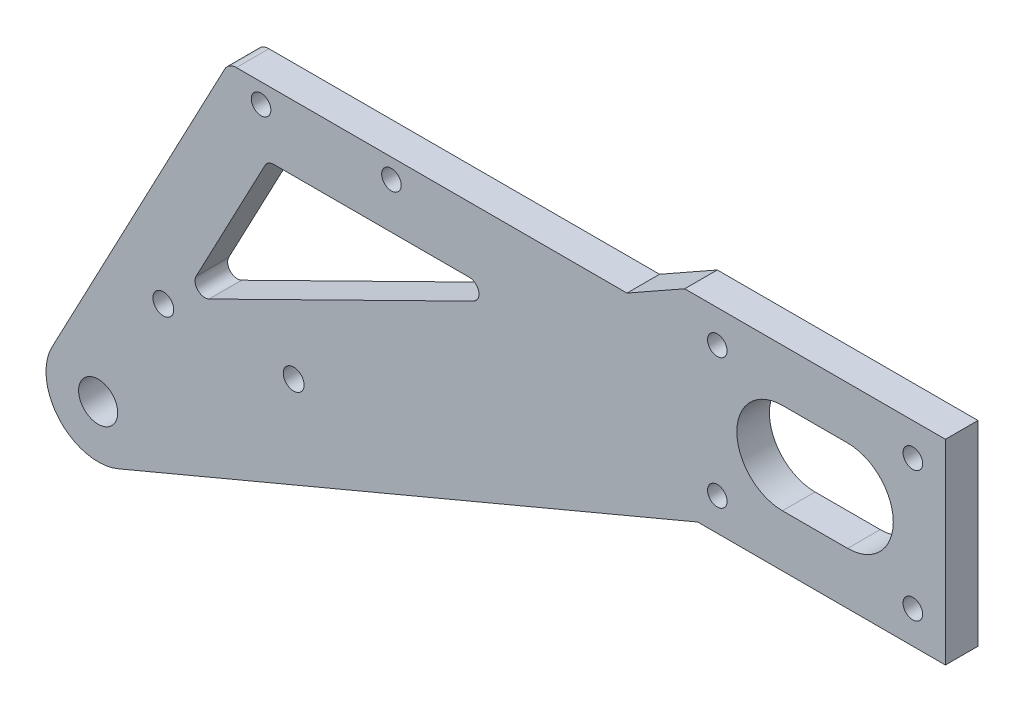
ISO-10303-21;
HEADER;
FILE_DESCRIPTION(('STEP AP214'),'2;1');
FILE_NAME('part.step','',(''),(''),'','','');
FILE_SCHEMA(('AUTOMOTIVE_DESIGN { 1 0 10303 214 1 1 1 1 }'));
ENDSEC;
DATA;
#1=APPLICATION_CONTEXT('core data for automotive mechanical design processes');
#2=APPLICATION_PROTOCOL_DEFINITION('international standard','automotive_design',2000,#1);
#3=PRODUCT_CONTEXT('',#1,'mechanical');
#4=PRODUCT('Part','Part','',(#3));
#5=PRODUCT_RELATED_PRODUCT_CATEGORY('part','',(#4));
#6=PRODUCT_DEFINITION_FORMATION('','',#4);
#7=PRODUCT_DEFINITION_CONTEXT('part definition',#1,'design');
#8=PRODUCT_DEFINITION('design','',#6,#7);
#9=PRODUCT_DEFINITION_SHAPE('','',#8);
#10=(LENGTH_UNIT() NAMED_UNIT(*) SI_UNIT(.MILLI.,.METRE.));
#11=(NAMED_UNIT(*) PLANE_ANGLE_UNIT() SI_UNIT($,.RADIAN.));
#12=(NAMED_UNIT(*) SI_UNIT($,.STERADIAN.) SOLID_ANGLE_UNIT());
#13=UNCERTAINTY_MEASURE_WITH_UNIT(LENGTH_MEASURE(1.E-05),#10,'distance_accuracy_value','');
#14=(GEOMETRIC_REPRESENTATION_CONTEXT(3) GLOBAL_UNCERTAINTY_ASSIGNED_CONTEXT((#13)) GLOBAL_UNIT_ASSIGNED_CONTEXT((#10,
#11,#12)) REPRESENTATION_CONTEXT('',''));
#15=CARTESIAN_POINT('',(0.,0.,0.));
#16=DIRECTION('',(0.,0.,1.));
#17=DIRECTION('',(1.,0.,0.));
#18=AXIS2_PLACEMENT_3D('',#15,#16,#17);
#19=CARTESIAN_POINT('',(0.,0.,5.));
#20=DIRECTION('',(0.,0.,1.));
#21=DIRECTION('',(1.,0.,0.));
#22=AXIS2_PLACEMENT_3D('',#19,#20,#21);
#23=PLANE('',#22);
#24=CARTESIAN_POINT('',(10.,18.,5.));
#25=DIRECTION('',(0.,0.,1.));
#26=DIRECTION('',(1.,0.,0.));
#27=AXIS2_PLACEMENT_3D('',#24,#25,#26);
#28=CIRCLE('',#27,1.6);
#29=CARTESIAN_POINT('',(11.6,18.,5.));
#30=VERTEX_POINT('',#29);
#31=EDGE_CURVE('E713',#30,#30,#28,.T.);
#32=ORIENTED_EDGE('',*,*,#31,.F.);
#33=EDGE_LOOP('',(#32));
#34=FACE_BOUND('',#33,.T.);
#35=CARTESIAN_POINT('',(30.,18.,5.));
#36=DIRECTION('',(0.,0.,1.));
#37=DIRECTION('',(1.,0.,0.));
#38=AXIS2_PLACEMENT_3D('',#35,#36,#37);
#39=CIRCLE('',#38,1.6);
#40=CARTESIAN_POINT('',(31.6,18.,5.));
#41=VERTEX_POINT('',#40);
#42=EDGE_CURVE('E197',#41,#41,#39,.T.);
#43=ORIENTED_EDGE('',*,*,#42,.F.);
#44=EDGE_LOOP('',(#43));
#45=FACE_BOUND('',#44,.T.);
#46=CARTESIAN_POINT('',(56.9317860296705,43.5,5.));
#47=DIRECTION('',(0.,0.,1.));
#48=DIRECTION('',(1.,0.,0.));
#49=AXIS2_PLACEMENT_3D('',#46,#47,#48);
#50=CIRCLE('',#49,1.50000000000001);
#51=CARTESIAN_POINT('',(57.5951320607567,42.1546479854543,5.));
#52=VERTEX_POINT('',#51);
#53=CARTESIAN_POINT('',(56.9317860296705,45.,5.));
#54=VERTEX_POINT('',#53);
#55=EDGE_CURVE('E172',#52,#54,#50,.T.);
#56=ORIENTED_EDGE('',*,*,#55,.F.);
#57=DIRECTION('',(0.896901343030464,0.442230687390812,0.));
#58=VECTOR('',#57,1.);
#59=CARTESIAN_POINT('',(17.0325312009098,22.1546479854543,5.));
#60=LINE('',#59,#58);
#61=CARTESIAN_POINT('',(17.0325312009098,22.1546479854543,5.));
#62=VERTEX_POINT('',#61);
#63=EDGE_CURVE('E191',#62,#52,#60,.T.);
#64=ORIENTED_EDGE('',*,*,#63,.F.);
#65=CARTESIAN_POINT('',(16.3691851698236,23.5,5.));
#66=DIRECTION('',(0.,0.,1.));
#67=DIRECTION('',(1.,0.,0.));
#68=AXIS2_PLACEMENT_3D('',#65,#66,#67);
#69=CIRCLE('',#68,1.5);
#70=CARTESIAN_POINT('',(15.0428009644484,24.2005033474091,5.));
#71=VERTEX_POINT('',#70);
#72=EDGE_CURVE('E194',#71,#62,#69,.T.);
#73=ORIENTED_EDGE('',*,*,#72,.F.);
#74=DIRECTION('',(-0.46700223160609,-0.884256136916748,0.));
#75=VECTOR('',#74,1.);
#76=CARTESIAN_POINT('',(25.6054018242954,44.2005033474091,5.));
#77=LINE('',#76,#75);
#78=CARTESIAN_POINT('',(25.6054018242954,44.2005033474091,5.));
#79=VERTEX_POINT('',#78);
#80=EDGE_CURVE('E214',#79,#71,#77,.T.);
#81=ORIENTED_EDGE('',*,*,#80,.F.);
#82=CARTESIAN_POINT('',(26.9317860296705,43.5,5.));
#83=DIRECTION('',(0.,0.,1.));
#84=DIRECTION('',(-1.,0.,0.));
#85=AXIS2_PLACEMENT_3D('',#82,#83,#84);
#86=CIRCLE('',#85,1.5);
#87=CARTESIAN_POINT('',(26.9317860296705,45.,5.));
#88=VERTEX_POINT('',#87);
#89=EDGE_CURVE('E211',#88,#79,#86,.T.);
#90=ORIENTED_EDGE('',*,*,#89,.F.);
#91=DIRECTION('',(-1.,0.,0.));
#92=VECTOR('',#91,1.);
#93=CARTESIAN_POINT('',(56.9317860296705,45.,5.));
#94=LINE('',#93,#92);
#95=EDGE_CURVE('E208',#54,#88,#94,.T.);
#96=ORIENTED_EDGE('',*,*,#95,.F.);
#97=EDGE_LOOP('',(#56,#64,#73,#81,#90,#96));
#98=FACE_BOUND('',#97,.T.);
#99=CARTESIAN_POINT('',(105.,45.,5.));
#100=DIRECTION('',(0.,0.,1.));
#101=DIRECTION('',(1.,0.,0.));
#102=AXIS2_PLACEMENT_3D('',#99,#100,#101);
#103=CIRCLE('',#102,7.);
#104=CARTESIAN_POINT('',(105.,52.,5.));
#105=VERTEX_POINT('',#104);
#106=CARTESIAN_POINT('',(105.,38.,5.));
#107=VERTEX_POINT('',#106);
#108=EDGE_CURVE('E243',#105,#107,#103,.T.);
#109=ORIENTED_EDGE('',*,*,#108,.F.);
#110=DIRECTION('',(-1.,0.,0.));
#111=VECTOR('',#110,1.);
#112=CARTESIAN_POINT('',(105.,52.,5.));
#113=LINE('',#112,#111);
#114=CARTESIAN_POINT('',(115.,52.,5.));
#115=VERTEX_POINT('',#114);
#116=EDGE_CURVE('E233',#115,#105,#113,.T.);
#117=ORIENTED_EDGE('',*,*,#116,.F.);
#118=CARTESIAN_POINT('',(115.,45.,5.));
#119=DIRECTION('',(0.,0.,1.));
#120=DIRECTION('',(1.,0.,0.));
#121=AXIS2_PLACEMENT_3D('',#118,#119,#120);
#122=CIRCLE('',#121,7.);
#123=CARTESIAN_POINT('',(115.,38.,5.));
#124=VERTEX_POINT('',#123);
#125=EDGE_CURVE('E249',#124,#115,#122,.T.);
#126=ORIENTED_EDGE('',*,*,#125,.F.);
#127=DIRECTION('',(1.,0.,0.));
#128=VECTOR('',#127,1.);
#129=CARTESIAN_POINT('',(105.,38.,5.));
#130=LINE('',#129,#128);
#131=EDGE_CURVE('E245',#107,#124,#130,.T.);
#132=ORIENTED_EDGE('',*,*,#131,.F.);
#133=EDGE_LOOP('',(#109,#117,#126,#132));
#134=FACE_BOUND('',#133,.T.);
#135=DIRECTION('',(-1.,0.,0.));
#136=VECTOR('',#135,1.);
#137=CARTESIAN_POINT('',(81.1440012162749,55.,5.));
#138=LINE('',#137,#136);
#139=CARTESIAN_POINT('',(81.1440012162749,55.,5.));
#140=VERTEX_POINT('',#139);
#141=CARTESIAN_POINT('',(21.2055280051601,55.,5.));
#142=VERTEX_POINT('',#141);
#143=EDGE_CURVE('E271',#140,#142,#138,.T.);
#144=ORIENTED_EDGE('',*,*,#143,.T.);
#145=CARTESIAN_POINT('',(21.2055280051601,53.,5.));
#146=DIRECTION('',(0.,0.,1.));
#147=DIRECTION('',(1.,0.,0.));
#148=AXIS2_PLACEMENT_3D('',#145,#146,#147);
#149=CIRCLE('',#148,2.);
#150=CARTESIAN_POINT('',(19.4370157313266,53.9340044632121,5.));
#151=VERTEX_POINT('',#150);
#152=EDGE_CURVE('E58',#142,#151,#149,.T.);
#153=ORIENTED_EDGE('',*,*,#152,.T.);
#154=DIRECTION('',(-0.46700223160609,-0.884256136916748,0.));
#155=VECTOR('',#154,1.);
#156=CARTESIAN_POINT('',(-7.07404909533399,3.73601785284872,5.));
#157=LINE('',#156,#155);
#158=CARTESIAN_POINT('',(-7.07404909533399,3.73601785284872,5.));
#159=VERTEX_POINT('',#158);
#160=EDGE_CURVE('E221',#151,#159,#157,.T.);
#161=ORIENTED_EDGE('',*,*,#160,.T.);
#162=CARTESIAN_POINT('',(0.,0.,5.));
#163=DIRECTION('',(0.,0.,1.));
#164=DIRECTION('',(1.,0.,0.));
#165=AXIS2_PLACEMENT_3D('',#162,#163,#164);
#166=CIRCLE('',#165,8.);
#167=CARTESIAN_POINT('',(3.10046580802895,-7.37476181128878,5.));
#168=VERTEX_POINT('',#167);
#169=EDGE_CURVE('E316',#159,#168,#166,.T.);
#170=ORIENTED_EDGE('',*,*,#169,.T.);
#171=DIRECTION('',(0.921845226411098,0.387558226003619,0.));
#172=VECTOR('',#171,1.);
#173=CARTESIAN_POINT('',(92.,30.,5.));
#174=LINE('',#173,#172);
#175=CARTESIAN_POINT('',(92.,30.,5.));
#176=VERTEX_POINT('',#175);
#177=EDGE_CURVE('E318',#168,#176,#174,.T.);
#178=ORIENTED_EDGE('',*,*,#177,.T.);
#179=DIRECTION('',(1.,0.,0.));
#180=VECTOR('',#179,1.);
#181=CARTESIAN_POINT('',(92.,30.,5.));
#182=LINE('',#181,#180);
#183=CARTESIAN_POINT('',(130.,30.,5.));
#184=VERTEX_POINT('',#183);
#185=EDGE_CURVE('E321',#176,#184,#182,.T.);
#186=ORIENTED_EDGE('',*,*,#185,.T.);
#187=DIRECTION('',(0.,1.,0.));
#188=VECTOR('',#187,1.);
#189=CARTESIAN_POINT('',(130.,60.,5.));
#190=LINE('',#189,#188);
#191=CARTESIAN_POINT('',(130.,60.,5.));
#192=VERTEX_POINT('',#191);
#193=EDGE_CURVE('E323',#184,#192,#190,.T.);
#194=ORIENTED_EDGE('',*,*,#193,.T.);
#195=DIRECTION('',(-1.,0.,0.));
#196=VECTOR('',#195,1.);
#197=CARTESIAN_POINT('',(90.,60.,5.));
#198=LINE('',#197,#196);
#199=CARTESIAN_POINT('',(90.,60.,5.));
#200=VERTEX_POINT('',#199);
#201=EDGE_CURVE('E325',#192,#200,#198,.T.);
#202=ORIENTED_EDGE('',*,*,#201,.T.);
#203=DIRECTION('',(-0.870797121650983,-0.4916425255451,0.));
#204=VECTOR('',#203,1.);
#205=CARTESIAN_POINT('',(-3.9331402043608,6.96637697320786,5.));
#206=LINE('',#205,#204);
#207=EDGE_CURVE('E327',#200,#140,#206,.T.);
#208=ORIENTED_EDGE('',*,*,#207,.T.);
#209=EDGE_LOOP('',(#144,#153,#161,#170,#178,#186,#194,#202,#208));
#210=FACE_BOUND('',#209,.T.);
#211=CARTESIAN_POINT('',(25.,52.,5.));
#212=DIRECTION('',(0.,0.,1.));
#213=DIRECTION('',(1.,0.,0.));
#214=AXIS2_PLACEMENT_3D('',#211,#212,#213);
#215=CIRCLE('',#214,1.5);
#216=CARTESIAN_POINT('',(26.5,52.,5.));
#217=VERTEX_POINT('',#216);
#218=EDGE_CURVE('E272',#217,#217,#215,.T.);
#219=ORIENTED_EDGE('',*,*,#218,.F.);
#220=EDGE_LOOP('',(#219));
#221=FACE_BOUND('',#220,.T.);
#222=CARTESIAN_POINT('',(45.,52.,5.));
#223=DIRECTION('',(0.,0.,1.));
#224=DIRECTION('',(1.,0.,0.));
#225=AXIS2_PLACEMENT_3D('',#222,#223,#224);
#226=CIRCLE('',#225,1.5);
#227=CARTESIAN_POINT('',(46.5,52.,5.));
#228=VERTEX_POINT('',#227);
#229=EDGE_CURVE('E263',#228,#228,#226,.T.);
#230=ORIENTED_EDGE('',*,*,#229,.F.);
#231=EDGE_LOOP('',(#230));
#232=FACE_BOUND('',#231,.T.);
#233=CARTESIAN_POINT('',(125.,35.,5.));
#234=DIRECTION('',(0.,0.,1.));
#235=DIRECTION('',(1.,0.,0.));
#236=AXIS2_PLACEMENT_3D('',#233,#234,#235);
#237=CIRCLE('',#236,1.5);
#238=CARTESIAN_POINT('',(126.5,35.,5.));
#239=VERTEX_POINT('',#238);
#240=EDGE_CURVE('E292',#239,#239,#237,.T.);
#241=ORIENTED_EDGE('',*,*,#240,.F.);
#242=EDGE_LOOP('',(#241));
#243=FACE_BOUND('',#242,.T.);
#244=CARTESIAN_POINT('',(125.,55.,5.));
#245=DIRECTION('',(0.,0.,1.));
#246=DIRECTION('',(1.,0.,0.));
#247=AXIS2_PLACEMENT_3D('',#244,#245,#246);
#248=CIRCLE('',#247,1.5);
#249=CARTESIAN_POINT('',(126.5,55.,5.));
#250=VERTEX_POINT('',#249);
#251=EDGE_CURVE('E304',#250,#250,#248,.T.);
#252=ORIENTED_EDGE('',*,*,#251,.F.);
#253=EDGE_LOOP('',(#252));
#254=FACE_BOUND('',#253,.T.);
#255=CARTESIAN_POINT('',(0.,0.,5.));
#256=DIRECTION('',(0.,0.,1.));
#257=DIRECTION('',(1.,0.,0.));
#258=AXIS2_PLACEMENT_3D('',#255,#256,#257);
#259=CIRCLE('',#258,3.);
#260=CARTESIAN_POINT('',(3.,0.,5.));
#261=VERTEX_POINT('',#260);
#262=EDGE_CURVE('E310',#261,#261,#259,.T.);
#263=ORIENTED_EDGE('',*,*,#262,.F.);
#264=EDGE_LOOP('',(#263));
#265=FACE_BOUND('',#264,.T.);
#266=CARTESIAN_POINT('',(95.,55.,5.));
#267=DIRECTION('',(0.,0.,1.));
#268=DIRECTION('',(1.,0.,0.));
#269=AXIS2_PLACEMENT_3D('',#266,#267,#268);
#270=CIRCLE('',#269,1.5);
#271=CARTESIAN_POINT('',(96.5,55.,5.));
#272=VERTEX_POINT('',#271);
#273=EDGE_CURVE('E298',#272,#272,#270,.T.);
#274=ORIENTED_EDGE('',*,*,#273,.F.);
#275=EDGE_LOOP('',(#274));
#276=FACE_BOUND('',#275,.T.);
#277=CARTESIAN_POINT('',(95.,35.,5.));
#278=DIRECTION('',(0.,0.,1.));
#279=DIRECTION('',(1.,0.,0.));
#280=AXIS2_PLACEMENT_3D('',#277,#278,#279);
#281=CIRCLE('',#280,1.5);
#282=CARTESIAN_POINT('',(96.5,35.,5.));
#283=VERTEX_POINT('',#282);
#284=EDGE_CURVE('E286',#283,#283,#281,.T.);
#285=ORIENTED_EDGE('',*,*,#284,.F.);
#286=EDGE_LOOP('',(#285));
#287=FACE_BOUND('',#286,.T.);
#288=ADVANCED_FACE('F36',(#34,#45,#98,#134,#210,#221,#232,#243,#254,#265,#276,#287),#23,.T.);
#289=CARTESIAN_POINT('',(0.,0.,0.));
#290=DIRECTION('',(0.,0.,1.));
#291=DIRECTION('',(1.,0.,0.));
#292=AXIS2_PLACEMENT_3D('',#289,#290,#291);
#293=PLANE('',#292);
#294=CARTESIAN_POINT('',(10.,18.,0.));
#295=DIRECTION('',(0.,0.,1.));
#296=DIRECTION('',(1.,0.,0.));
#297=AXIS2_PLACEMENT_3D('',#294,#295,#296);
#298=CIRCLE('',#297,1.6);
#299=CARTESIAN_POINT('',(11.6,18.,0.));
#300=VERTEX_POINT('',#299);
#301=EDGE_CURVE('E246',#300,#300,#298,.T.);
#302=ORIENTED_EDGE('',*,*,#301,.T.);
#303=EDGE_LOOP('',(#302));
#304=FACE_BOUND('',#303,.T.);
#305=CARTESIAN_POINT('',(30.,18.,0.));
#306=DIRECTION('',(0.,0.,1.));
#307=DIRECTION('',(1.,0.,0.));
#308=AXIS2_PLACEMENT_3D('',#305,#306,#307);
#309=CIRCLE('',#308,1.6);
#310=CARTESIAN_POINT('',(31.6,18.,0.));
#311=VERTEX_POINT('',#310);
#312=EDGE_CURVE('E710',#311,#311,#309,.T.);
#313=ORIENTED_EDGE('',*,*,#312,.T.);
#314=EDGE_LOOP('',(#313));
#315=FACE_BOUND('',#314,.T.);
#316=DIRECTION('',(0.896901343030464,0.442230687390812,0.));
#317=VECTOR('',#316,1.);
#318=CARTESIAN_POINT('',(17.0325312009098,22.1546479854543,0.));
#319=LINE('',#318,#317);
#320=CARTESIAN_POINT('',(17.0325312009098,22.1546479854543,0.));
#321=VERTEX_POINT('',#320);
#322=CARTESIAN_POINT('',(57.5951320607567,42.1546479854543,0.));
#323=VERTEX_POINT('',#322);
#324=EDGE_CURVE('E177',#321,#323,#319,.T.);
#325=ORIENTED_EDGE('',*,*,#324,.T.);
#326=CARTESIAN_POINT('',(56.9317860296705,43.5,0.));
#327=DIRECTION('',(0.,0.,1.));
#328=DIRECTION('',(1.,0.,0.));
#329=AXIS2_PLACEMENT_3D('',#326,#327,#328);
#330=CIRCLE('',#329,1.50000000000001);
#331=CARTESIAN_POINT('',(56.9317860296705,45.,0.));
#332=VERTEX_POINT('',#331);
#333=EDGE_CURVE('E169',#323,#332,#330,.T.);
#334=ORIENTED_EDGE('',*,*,#333,.T.);
#335=DIRECTION('',(-1.,0.,0.));
#336=VECTOR('',#335,1.);
#337=CARTESIAN_POINT('',(56.9317860296705,45.,0.));
#338=LINE('',#337,#336);
#339=CARTESIAN_POINT('',(26.9317860296705,45.,0.));
#340=VERTEX_POINT('',#339);
#341=EDGE_CURVE('E181',#332,#340,#338,.T.);
#342=ORIENTED_EDGE('',*,*,#341,.T.);
#343=CARTESIAN_POINT('',(26.9317860296705,43.5,0.));
#344=DIRECTION('',(0.,0.,1.));
#345=DIRECTION('',(-1.,0.,0.));
#346=AXIS2_PLACEMENT_3D('',#343,#344,#345);
#347=CIRCLE('',#346,1.5);
#348=CARTESIAN_POINT('',(25.6054018242954,44.2005033474091,0.));
#349=VERTEX_POINT('',#348);
#350=EDGE_CURVE('E185',#340,#349,#347,.T.);
#351=ORIENTED_EDGE('',*,*,#350,.T.);
#352=DIRECTION('',(-0.46700223160609,-0.884256136916748,0.));
#353=VECTOR('',#352,1.);
#354=CARTESIAN_POINT('',(25.6054018242954,44.2005033474091,0.));
#355=LINE('',#354,#353);
#356=CARTESIAN_POINT('',(15.0428009644484,24.2005033474091,0.));
#357=VERTEX_POINT('',#356);
#358=EDGE_CURVE('E201',#349,#357,#355,.T.);
#359=ORIENTED_EDGE('',*,*,#358,.T.);
#360=CARTESIAN_POINT('',(16.3691851698236,23.5,0.));
#361=DIRECTION('',(0.,0.,1.));
#362=DIRECTION('',(1.,0.,0.));
#363=AXIS2_PLACEMENT_3D('',#360,#361,#362);
#364=CIRCLE('',#363,1.5);
#365=EDGE_CURVE('E204',#357,#321,#364,.T.);
#366=ORIENTED_EDGE('',*,*,#365,.T.);
#367=EDGE_LOOP('',(#325,#334,#342,#351,#359,#366));
#368=FACE_BOUND('',#367,.T.);
#369=DIRECTION('',(-1.,0.,0.));
#370=VECTOR('',#369,1.);
#371=CARTESIAN_POINT('',(105.,52.,0.));
#372=LINE('',#371,#370);
#373=CARTESIAN_POINT('',(115.,52.,0.));
#374=VERTEX_POINT('',#373);
#375=CARTESIAN_POINT('',(105.,52.,0.));
#376=VERTEX_POINT('',#375);
#377=EDGE_CURVE('E239',#374,#376,#372,.T.);
#378=ORIENTED_EDGE('',*,*,#377,.T.);
#379=CARTESIAN_POINT('',(105.,45.,0.));
#380=DIRECTION('',(0.,0.,1.));
#381=DIRECTION('',(1.,0.,0.));
#382=AXIS2_PLACEMENT_3D('',#379,#380,#381);
#383=CIRCLE('',#382,7.);
#384=CARTESIAN_POINT('',(105.,38.,0.));
#385=VERTEX_POINT('',#384);
#386=EDGE_CURVE('E229',#376,#385,#383,.T.);
#387=ORIENTED_EDGE('',*,*,#386,.T.);
#388=DIRECTION('',(1.,0.,0.));
#389=VECTOR('',#388,1.);
#390=CARTESIAN_POINT('',(105.,38.,0.));
#391=LINE('',#390,#389);
#392=CARTESIAN_POINT('',(115.,38.,0.));
#393=VERTEX_POINT('',#392);
#394=EDGE_CURVE('E232',#385,#393,#391,.T.);
#395=ORIENTED_EDGE('',*,*,#394,.T.);
#396=CARTESIAN_POINT('',(115.,45.,0.));
#397=DIRECTION('',(0.,0.,1.));
#398=DIRECTION('',(1.,0.,0.));
#399=AXIS2_PLACEMENT_3D('',#396,#397,#398);
#400=CIRCLE('',#399,7.);
#401=EDGE_CURVE('E236',#393,#374,#400,.T.);
#402=ORIENTED_EDGE('',*,*,#401,.T.);
#403=EDGE_LOOP('',(#378,#387,#395,#402));
#404=FACE_BOUND('',#403,.T.);
#405=DIRECTION('',(0.46700223160609,0.884256136916749,0.));
#406=VECTOR('',#405,1.);
#407=CARTESIAN_POINT('',(-7.07404909533399,3.73601785284872,0.));
#408=LINE('',#407,#406);
#409=CARTESIAN_POINT('',(-7.07404909533399,3.73601785284872,0.));
#410=VERTEX_POINT('',#409);
#411=CARTESIAN_POINT('',(19.4370157313266,53.9340044632122,0.));
#412=VERTEX_POINT('',#411);
#413=EDGE_CURVE('E261',#410,#412,#408,.T.);
#414=ORIENTED_EDGE('',*,*,#413,.T.);
#415=CARTESIAN_POINT('',(21.2055280051601,53.,0.));
#416=DIRECTION('',(0.,0.,1.));
#417=DIRECTION('',(1.,0.,0.));
#418=AXIS2_PLACEMENT_3D('',#415,#416,#417);
#419=CIRCLE('',#418,2.);
#420=CARTESIAN_POINT('',(21.2055280051601,55.,0.));
#421=VERTEX_POINT('',#420);
#422=EDGE_CURVE('E11',#412,#421,#419,.F.);
#423=ORIENTED_EDGE('',*,*,#422,.T.);
#424=DIRECTION('',(1.,0.,0.));
#425=VECTOR('',#424,1.);
#426=CARTESIAN_POINT('',(81.1440012162749,55.,0.));
#427=LINE('',#426,#425);
#428=CARTESIAN_POINT('',(81.1440012162749,55.,0.));
#429=VERTEX_POINT('',#428);
#430=EDGE_CURVE('E283',#421,#429,#427,.T.);
#431=ORIENTED_EDGE('',*,*,#430,.T.);
#432=DIRECTION('',(-0.870797121650983,-0.4916425255451,0.));
#433=VECTOR('',#432,1.);
#434=CARTESIAN_POINT('',(-3.9331402043608,6.96637697320786,0.));
#435=LINE('',#434,#433);
#436=CARTESIAN_POINT('',(90.,60.,0.));
#437=VERTEX_POINT('',#436);
#438=EDGE_CURVE('E319',#437,#429,#435,.T.);
#439=ORIENTED_EDGE('',*,*,#438,.F.);
#440=DIRECTION('',(-1.,0.,0.));
#441=VECTOR('',#440,1.);
#442=CARTESIAN_POINT('',(90.,60.,0.));
#443=LINE('',#442,#441);
#444=CARTESIAN_POINT('',(130.,60.,0.));
#445=VERTEX_POINT('',#444);
#446=EDGE_CURVE('E338',#445,#437,#443,.T.);
#447=ORIENTED_EDGE('',*,*,#446,.F.);
#448=DIRECTION('',(0.,1.,0.));
#449=VECTOR('',#448,1.);
#450=CARTESIAN_POINT('',(130.,60.,0.));
#451=LINE('',#450,#449);
#452=CARTESIAN_POINT('',(130.,30.,0.));
#453=VERTEX_POINT('',#452);
#454=EDGE_CURVE('E336',#453,#445,#451,.T.);
#455=ORIENTED_EDGE('',*,*,#454,.F.);
#456=DIRECTION('',(1.,0.,0.));
#457=VECTOR('',#456,1.);
#458=CARTESIAN_POINT('',(92.,30.,0.));
#459=LINE('',#458,#457);
#460=CARTESIAN_POINT('',(92.,30.,0.));
#461=VERTEX_POINT('',#460);
#462=EDGE_CURVE('E334',#461,#453,#459,.T.);
#463=ORIENTED_EDGE('',*,*,#462,.F.);
#464=DIRECTION('',(0.921845226411098,0.387558226003619,0.));
#465=VECTOR('',#464,1.);
#466=CARTESIAN_POINT('',(92.,30.,0.));
#467=LINE('',#466,#465);
#468=CARTESIAN_POINT('',(3.10046580802895,-7.37476181128878,0.));
#469=VERTEX_POINT('',#468);
#470=EDGE_CURVE('E332',#469,#461,#467,.T.);
#471=ORIENTED_EDGE('',*,*,#470,.F.);
#472=CARTESIAN_POINT('',(0.,0.,0.));
#473=DIRECTION('',(0.,0.,1.));
#474=DIRECTION('',(1.,0.,0.));
#475=AXIS2_PLACEMENT_3D('',#472,#473,#474);
#476=CIRCLE('',#475,8.);
#477=EDGE_CURVE('E313',#410,#469,#476,.T.);
#478=ORIENTED_EDGE('',*,*,#477,.F.);
#479=EDGE_LOOP('',(#414,#423,#431,#439,#447,#455,#463,#471,#478));
#480=FACE_BOUND('',#479,.T.);
#481=CARTESIAN_POINT('',(25.,52.,0.));
#482=DIRECTION('',(0.,0.,1.));
#483=DIRECTION('',(1.,0.,0.));
#484=AXIS2_PLACEMENT_3D('',#481,#482,#483);
#485=CIRCLE('',#484,1.5);
#486=CARTESIAN_POINT('',(26.5,52.,0.));
#487=VERTEX_POINT('',#486);
#488=EDGE_CURVE('E268',#487,#487,#485,.T.);
#489=ORIENTED_EDGE('',*,*,#488,.T.);
#490=EDGE_LOOP('',(#489));
#491=FACE_BOUND('',#490,.T.);
#492=CARTESIAN_POINT('',(45.,52.,0.));
#493=DIRECTION('',(0.,0.,1.));
#494=DIRECTION('',(1.,0.,0.));
#495=AXIS2_PLACEMENT_3D('',#492,#493,#494);
#496=CIRCLE('',#495,1.5);
#497=CARTESIAN_POINT('',(46.5,52.,0.));
#498=VERTEX_POINT('',#497);
#499=EDGE_CURVE('E275',#498,#498,#496,.T.);
#500=ORIENTED_EDGE('',*,*,#499,.T.);
#501=EDGE_LOOP('',(#500));
#502=FACE_BOUND('',#501,.T.);
#503=CARTESIAN_POINT('',(0.,0.,0.));
#504=DIRECTION('',(0.,0.,1.));
#505=DIRECTION('',(1.,0.,0.));
#506=AXIS2_PLACEMENT_3D('',#503,#504,#505);
#507=CIRCLE('',#506,3.);
#508=CARTESIAN_POINT('',(3.,0.,0.));
#509=VERTEX_POINT('',#508);
#510=EDGE_CURVE('E307',#509,#509,#507,.T.);
#511=ORIENTED_EDGE('',*,*,#510,.T.);
#512=EDGE_LOOP('',(#511));
#513=FACE_BOUND('',#512,.T.);
#514=CARTESIAN_POINT('',(125.,55.,0.));
#515=DIRECTION('',(0.,0.,1.));
#516=DIRECTION('',(1.,0.,0.));
#517=AXIS2_PLACEMENT_3D('',#514,#515,#516);
#518=CIRCLE('',#517,1.5);
#519=CARTESIAN_POINT('',(126.5,55.,0.));
#520=VERTEX_POINT('',#519);
#521=EDGE_CURVE('E301',#520,#520,#518,.T.);
#522=ORIENTED_EDGE('',*,*,#521,.T.);
#523=EDGE_LOOP('',(#522));
#524=FACE_BOUND('',#523,.T.);
#525=CARTESIAN_POINT('',(95.,55.,0.));
#526=DIRECTION('',(0.,0.,1.));
#527=DIRECTION('',(1.,0.,0.));
#528=AXIS2_PLACEMENT_3D('',#525,#526,#527);
#529=CIRCLE('',#528,1.5);
#530=CARTESIAN_POINT('',(96.5,55.,0.));
#531=VERTEX_POINT('',#530);
#532=EDGE_CURVE('E295',#531,#531,#529,.T.);
#533=ORIENTED_EDGE('',*,*,#532,.T.);
#534=EDGE_LOOP('',(#533));
#535=FACE_BOUND('',#534,.T.);
#536=CARTESIAN_POINT('',(125.,35.,0.));
#537=DIRECTION('',(0.,0.,1.));
#538=DIRECTION('',(1.,0.,0.));
#539=AXIS2_PLACEMENT_3D('',#536,#537,#538);
#540=CIRCLE('',#539,1.5);
#541=CARTESIAN_POINT('',(126.5,35.,0.));
#542=VERTEX_POINT('',#541);
#543=EDGE_CURVE('E289',#542,#542,#540,.T.);
#544=ORIENTED_EDGE('',*,*,#543,.T.);
#545=EDGE_LOOP('',(#544));
#546=FACE_BOUND('',#545,.T.);
#547=CARTESIAN_POINT('',(95.,35.,0.));
#548=DIRECTION('',(0.,0.,1.));
#549=DIRECTION('',(1.,0.,0.));
#550=AXIS2_PLACEMENT_3D('',#547,#548,#549);
#551=CIRCLE('',#550,1.5);
#552=CARTESIAN_POINT('',(96.5,35.,0.));
#553=VERTEX_POINT('',#552);
#554=EDGE_CURVE('E285',#553,#553,#551,.T.);
#555=ORIENTED_EDGE('',*,*,#554,.T.);
#556=EDGE_LOOP('',(#555));
#557=FACE_BOUND('',#556,.T.);
#558=ADVANCED_FACE('F187',(#304,#315,#368,#404,#480,#491,#502,#513,#524,#535,#546,#557),#293,.F.);
#559=CARTESIAN_POINT('',(0.,0.,5.));
#560=DIRECTION('',(0.,0.,-1.));
#561=DIRECTION('',(-1.,0.,0.));
#562=AXIS2_PLACEMENT_3D('',#559,#560,#561);
#563=CYLINDRICAL_SURFACE('',#562,8.);
#564=ORIENTED_EDGE('',*,*,#169,.F.);
#565=DIRECTION('',(0.,0.,1.));
#566=VECTOR('',#565,1.);
#567=CARTESIAN_POINT('',(-7.07404909533399,3.73601785284872,-57.974132162543));
#568=LINE('',#567,#566);
#569=EDGE_CURVE('E264',#410,#159,#568,.T.);
#570=ORIENTED_EDGE('',*,*,#569,.F.);
#571=ORIENTED_EDGE('',*,*,#477,.T.);
#572=DIRECTION('',(0.,0.,-1.));
#573=VECTOR('',#572,1.);
#574=CARTESIAN_POINT('',(3.10046580802895,-7.37476181128878,5.));
#575=LINE('',#574,#573);
#576=EDGE_CURVE('E353',#168,#469,#575,.T.);
#577=ORIENTED_EDGE('',*,*,#576,.F.);
#578=EDGE_LOOP('',(#564,#570,#571,#577));
#579=FACE_BOUND('',#578,.T.);
#580=ADVANCED_FACE('F393',(#579),#563,.T.);
#581=CARTESIAN_POINT('',(92.,30.,5.));
#582=DIRECTION('',(-0.387558226003619,0.921845226411098,0.));
#583=DIRECTION('',(-0.921845226411098,-0.387558226003619,0.));
#584=AXIS2_PLACEMENT_3D('',#581,#582,#583);
#585=PLANE('',#584);
#586=ORIENTED_EDGE('',*,*,#470,.T.);
#587=DIRECTION('',(0.,0.,-1.));
#588=VECTOR('',#587,1.);
#589=CARTESIAN_POINT('',(92.,30.,5.));
#590=LINE('',#589,#588);
#591=EDGE_CURVE('E350',#176,#461,#590,.T.);
#592=ORIENTED_EDGE('',*,*,#591,.F.);
#593=ORIENTED_EDGE('',*,*,#177,.F.);
#594=ORIENTED_EDGE('',*,*,#576,.T.);
#595=EDGE_LOOP('',(#586,#592,#593,#594));
#596=FACE_BOUND('',#595,.T.);
#597=ADVANCED_FACE('F415',(#596),#585,.F.);
#598=CARTESIAN_POINT('',(92.,30.,5.));
#599=DIRECTION('',(0.,1.,0.));
#600=DIRECTION('',(0.,0.,1.));
#601=AXIS2_PLACEMENT_3D('',#598,#599,#600);
#602=PLANE('',#601);
#603=ORIENTED_EDGE('',*,*,#462,.T.);
#604=DIRECTION('',(0.,0.,-1.));
#605=VECTOR('',#604,1.);
#606=CARTESIAN_POINT('',(130.,30.,5.));
#607=LINE('',#606,#605);
#608=EDGE_CURVE('E347',#184,#453,#607,.T.);
#609=ORIENTED_EDGE('',*,*,#608,.F.);
#610=ORIENTED_EDGE('',*,*,#185,.F.);
#611=ORIENTED_EDGE('',*,*,#591,.T.);
#612=EDGE_LOOP('',(#603,#609,#610,#611));
#613=FACE_BOUND('',#612,.T.);
#614=ADVANCED_FACE('F411',(#613),#602,.F.);
#615=CARTESIAN_POINT('',(130.,60.,5.));
#616=DIRECTION('',(-1.,0.,0.));
#617=DIRECTION('',(0.,-1.,0.));
#618=AXIS2_PLACEMENT_3D('',#615,#616,#617);
#619=PLANE('',#618);
#620=ORIENTED_EDGE('',*,*,#454,.T.);
#621=DIRECTION('',(0.,0.,-1.));
#622=VECTOR('',#621,1.);
#623=CARTESIAN_POINT('',(130.,60.,5.));
#624=LINE('',#623,#622);
#625=EDGE_CURVE('E344',#192,#445,#624,.T.);
#626=ORIENTED_EDGE('',*,*,#625,.F.);
#627=ORIENTED_EDGE('',*,*,#193,.F.);
#628=ORIENTED_EDGE('',*,*,#608,.T.);
#629=EDGE_LOOP('',(#620,#626,#627,#628));
#630=FACE_BOUND('',#629,.T.);
#631=ADVANCED_FACE('F407',(#630),#619,.F.);
#632=CARTESIAN_POINT('',(90.,60.,5.));
#633=DIRECTION('',(0.,-1.,0.));
#634=DIRECTION('',(0.,0.,-1.));
#635=AXIS2_PLACEMENT_3D('',#632,#633,#634);
#636=PLANE('',#635);
#637=ORIENTED_EDGE('',*,*,#446,.T.);
#638=DIRECTION('',(0.,0.,-1.));
#639=VECTOR('',#638,1.);
#640=CARTESIAN_POINT('',(90.,60.,5.));
#641=LINE('',#640,#639);
#642=EDGE_CURVE('E330',#200,#437,#641,.T.);
#643=ORIENTED_EDGE('',*,*,#642,.F.);
#644=ORIENTED_EDGE('',*,*,#201,.F.);
#645=ORIENTED_EDGE('',*,*,#625,.T.);
#646=EDGE_LOOP('',(#637,#643,#644,#645));
#647=FACE_BOUND('',#646,.T.);
#648=ADVANCED_FACE('F404',(#647),#636,.F.);
#649=CARTESIAN_POINT('',(-3.9331402043608,6.96637697320786,5.));
#650=DIRECTION('',(0.4916425255451,-0.870797121650983,0.));
#651=DIRECTION('',(0.870797121650983,0.4916425255451,0.));
#652=AXIS2_PLACEMENT_3D('',#649,#650,#651);
#653=PLANE('',#652);
#654=ORIENTED_EDGE('',*,*,#438,.T.);
#655=DIRECTION('',(0.,0.,1.));
#656=VECTOR('',#655,1.);
#657=CARTESIAN_POINT('',(81.1440012162749,55.,-70.2161269209863));
#658=LINE('',#657,#656);
#659=EDGE_CURVE('E281',#429,#140,#658,.T.);
#660=ORIENTED_EDGE('',*,*,#659,.T.);
#661=ORIENTED_EDGE('',*,*,#207,.F.);
#662=ORIENTED_EDGE('',*,*,#642,.T.);
#663=EDGE_LOOP('',(#654,#660,#661,#662));
#664=FACE_BOUND('',#663,.T.);
#665=ADVANCED_FACE('F372',(#664),#653,.F.);
#666=CARTESIAN_POINT('',(0.,0.,5.));
#667=DIRECTION('',(0.,0.,-1.));
#668=DIRECTION('',(-1.,0.,0.));
#669=AXIS2_PLACEMENT_3D('',#666,#667,#668);
#670=CYLINDRICAL_SURFACE('',#669,3.);
#671=ORIENTED_EDGE('',*,*,#262,.T.);
#672=EDGE_LOOP('',(#671));
#673=FACE_BOUND('',#672,.T.);
#674=ORIENTED_EDGE('',*,*,#510,.F.);
#675=EDGE_LOOP('',(#674));
#676=FACE_BOUND('',#675,.T.);
#677=ADVANCED_FACE('F399',(#673,#676),#670,.F.);
#678=CARTESIAN_POINT('',(125.,55.,5.));
#679=DIRECTION('',(0.,0.,-1.));
#680=DIRECTION('',(-1.,0.,0.));
#681=AXIS2_PLACEMENT_3D('',#678,#679,#680);
#682=CYLINDRICAL_SURFACE('',#681,1.5);
#683=ORIENTED_EDGE('',*,*,#251,.T.);
#684=EDGE_LOOP('',(#683));
#685=FACE_BOUND('',#684,.T.);
#686=ORIENTED_EDGE('',*,*,#521,.F.);
#687=EDGE_LOOP('',(#686));
#688=FACE_BOUND('',#687,.T.);
#689=ADVANCED_FACE('F466',(#685,#688),#682,.F.);
#690=CARTESIAN_POINT('',(95.,55.,5.));
#691=DIRECTION('',(0.,0.,-1.));
#692=DIRECTION('',(-1.,0.,0.));
#693=AXIS2_PLACEMENT_3D('',#690,#691,#692);
#694=CYLINDRICAL_SURFACE('',#693,1.5);
#695=ORIENTED_EDGE('',*,*,#273,.T.);
#696=EDGE_LOOP('',(#695));
#697=FACE_BOUND('',#696,.T.);
#698=ORIENTED_EDGE('',*,*,#532,.F.);
#699=EDGE_LOOP('',(#698));
#700=FACE_BOUND('',#699,.T.);
#701=ADVANCED_FACE('F463',(#697,#700),#694,.F.);
#702=CARTESIAN_POINT('',(125.,35.,5.));
#703=DIRECTION('',(0.,0.,-1.));
#704=DIRECTION('',(-1.,0.,0.));
#705=AXIS2_PLACEMENT_3D('',#702,#703,#704);
#706=CYLINDRICAL_SURFACE('',#705,1.5);
#707=ORIENTED_EDGE('',*,*,#240,.T.);
#708=EDGE_LOOP('',(#707));
#709=FACE_BOUND('',#708,.T.);
#710=ORIENTED_EDGE('',*,*,#543,.F.);
#711=EDGE_LOOP('',(#710));
#712=FACE_BOUND('',#711,.T.);
#713=ADVANCED_FACE('F459',(#709,#712),#706,.F.);
#714=CARTESIAN_POINT('',(95.,35.,5.));
#715=DIRECTION('',(0.,0.,-1.));
#716=DIRECTION('',(-1.,0.,0.));
#717=AXIS2_PLACEMENT_3D('',#714,#715,#716);
#718=CYLINDRICAL_SURFACE('',#717,1.5);
#719=ORIENTED_EDGE('',*,*,#284,.T.);
#720=EDGE_LOOP('',(#719));
#721=FACE_BOUND('',#720,.T.);
#722=ORIENTED_EDGE('',*,*,#554,.F.);
#723=EDGE_LOOP('',(#722));
#724=FACE_BOUND('',#723,.T.);
#725=ADVANCED_FACE('F456',(#721,#724),#718,.F.);
#726=CARTESIAN_POINT('',(81.1440012162749,55.,-70.2161269209863));
#727=DIRECTION('',(0.,1.,0.));
#728=DIRECTION('',(-1.,0.,0.));
#729=AXIS2_PLACEMENT_3D('',#726,#727,#728);
#730=PLANE('',#729);
#731=ORIENTED_EDGE('',*,*,#430,.F.);
#732=DIRECTION('',(0.,0.,1.));
#733=VECTOR('',#732,1.);
#734=CARTESIAN_POINT('',(21.2055280051601,55.,-70.2161269209863));
#735=LINE('',#734,#733);
#736=EDGE_CURVE('E356',#421,#142,#735,.T.);
#737=ORIENTED_EDGE('',*,*,#736,.T.);
#738=ORIENTED_EDGE('',*,*,#143,.F.);
#739=ORIENTED_EDGE('',*,*,#659,.F.);
#740=EDGE_LOOP('',(#731,#737,#738,#739));
#741=FACE_BOUND('',#740,.T.);
#742=ADVANCED_FACE('F363',(#741),#730,.T.);
#743=CARTESIAN_POINT('',(45.,52.,0.));
#744=DIRECTION('',(0.,0.,1.));
#745=DIRECTION('',(1.,0.,0.));
#746=AXIS2_PLACEMENT_3D('',#743,#744,#745);
#747=CYLINDRICAL_SURFACE('',#746,1.5);
#748=ORIENTED_EDGE('',*,*,#499,.F.);
#749=EDGE_LOOP('',(#748));
#750=FACE_BOUND('',#749,.T.);
#751=ORIENTED_EDGE('',*,*,#229,.T.);
#752=EDGE_LOOP('',(#751));
#753=FACE_BOUND('',#752,.T.);
#754=ADVANCED_FACE('F446',(#750,#753),#747,.F.);
#755=CARTESIAN_POINT('',(25.,52.,0.));
#756=DIRECTION('',(0.,0.,1.));
#757=DIRECTION('',(1.,0.,0.));
#758=AXIS2_PLACEMENT_3D('',#755,#756,#757);
#759=CYLINDRICAL_SURFACE('',#758,1.5);
#760=ORIENTED_EDGE('',*,*,#488,.F.);
#761=EDGE_LOOP('',(#760));
#762=FACE_BOUND('',#761,.T.);
#763=ORIENTED_EDGE('',*,*,#218,.T.);
#764=EDGE_LOOP('',(#763));
#765=FACE_BOUND('',#764,.T.);
#766=ADVANCED_FACE('F437',(#762,#765),#759,.F.);
#767=CARTESIAN_POINT('',(-7.07404909533399,3.73601785284872,-57.974132162543));
#768=DIRECTION('',(-0.884256136916748,0.46700223160609,0.));
#769=DIRECTION('',(-0.46700223160609,-0.884256136916749,0.));
#770=AXIS2_PLACEMENT_3D('',#767,#768,#769);
#771=PLANE('',#770);
#772=ORIENTED_EDGE('',*,*,#160,.F.);
#773=DIRECTION('',(0.,0.,1.));
#774=VECTOR('',#773,1.);
#775=CARTESIAN_POINT('',(19.4370157313266,53.9340044632122,-57.974132162543));
#776=LINE('',#775,#774);
#777=EDGE_CURVE('E44',#151,#412,#776,.F.);
#778=ORIENTED_EDGE('',*,*,#777,.T.);
#779=ORIENTED_EDGE('',*,*,#413,.F.);
#780=ORIENTED_EDGE('',*,*,#569,.T.);
#781=EDGE_LOOP('',(#772,#778,#779,#780));
#782=FACE_BOUND('',#781,.T.);
#783=ADVANCED_FACE('F434',(#782),#771,.T.);
#784=CARTESIAN_POINT('',(105.,45.,0.));
#785=DIRECTION('',(0.,0.,1.));
#786=DIRECTION('',(1.,0.,0.));
#787=AXIS2_PLACEMENT_3D('',#784,#785,#786);
#788=CYLINDRICAL_SURFACE('',#787,7.);
#789=ORIENTED_EDGE('',*,*,#108,.T.);
#790=DIRECTION('',(0.,0.,1.));
#791=VECTOR('',#790,1.);
#792=CARTESIAN_POINT('',(105.,38.,0.));
#793=LINE('',#792,#791);
#794=EDGE_CURVE('E242',#385,#107,#793,.T.);
#795=ORIENTED_EDGE('',*,*,#794,.F.);
#796=ORIENTED_EDGE('',*,*,#386,.F.);
#797=DIRECTION('',(0.,0.,1.));
#798=VECTOR('',#797,1.);
#799=CARTESIAN_POINT('',(105.,52.,0.));
#800=LINE('',#799,#798);
#801=EDGE_CURVE('E209',#376,#105,#800,.T.);
#802=ORIENTED_EDGE('',*,*,#801,.T.);
#803=EDGE_LOOP('',(#789,#795,#796,#802));
#804=FACE_BOUND('',#803,.T.);
#805=ADVANCED_FACE('F436',(#804),#788,.F.);
#806=CARTESIAN_POINT('',(105.,52.,0.));
#807=DIRECTION('',(0.,1.,0.));
#808=DIRECTION('',(0.,0.,1.));
#809=AXIS2_PLACEMENT_3D('',#806,#807,#808);
#810=PLANE('',#809);
#811=ORIENTED_EDGE('',*,*,#116,.T.);
#812=ORIENTED_EDGE('',*,*,#801,.F.);
#813=ORIENTED_EDGE('',*,*,#377,.F.);
#814=DIRECTION('',(0.,0.,1.));
#815=VECTOR('',#814,1.);
#816=CARTESIAN_POINT('',(115.,52.,0.));
#817=LINE('',#816,#815);
#818=EDGE_CURVE('E255',#374,#115,#817,.T.);
#819=ORIENTED_EDGE('',*,*,#818,.T.);
#820=EDGE_LOOP('',(#811,#812,#813,#819));
#821=FACE_BOUND('',#820,.T.);
#822=ADVANCED_FACE('F443',(#821),#810,.F.);
#823=CARTESIAN_POINT('',(115.,45.,0.));
#824=DIRECTION('',(0.,0.,1.));
#825=DIRECTION('',(1.,0.,0.));
#826=AXIS2_PLACEMENT_3D('',#823,#824,#825);
#827=CYLINDRICAL_SURFACE('',#826,7.);
#828=ORIENTED_EDGE('',*,*,#125,.T.);
#829=ORIENTED_EDGE('',*,*,#818,.F.);
#830=ORIENTED_EDGE('',*,*,#401,.F.);
#831=DIRECTION('',(0.,0.,1.));
#832=VECTOR('',#831,1.);
#833=CARTESIAN_POINT('',(115.,38.,0.));
#834=LINE('',#833,#832);
#835=EDGE_CURVE('E257',#393,#124,#834,.T.);
#836=ORIENTED_EDGE('',*,*,#835,.T.);
#837=EDGE_LOOP('',(#828,#829,#830,#836));
#838=FACE_BOUND('',#837,.T.);
#839=ADVANCED_FACE('F603',(#838),#827,.F.);
#840=CARTESIAN_POINT('',(105.,38.,0.));
#841=DIRECTION('',(0.,-1.,0.));
#842=DIRECTION('',(0.,0.,-1.));
#843=AXIS2_PLACEMENT_3D('',#840,#841,#842);
#844=PLANE('',#843);
#845=ORIENTED_EDGE('',*,*,#131,.T.);
#846=ORIENTED_EDGE('',*,*,#835,.F.);
#847=ORIENTED_EDGE('',*,*,#394,.F.);
#848=ORIENTED_EDGE('',*,*,#794,.T.);
#849=EDGE_LOOP('',(#845,#846,#847,#848));
#850=FACE_BOUND('',#849,.T.);
#851=ADVANCED_FACE('F613',(#850),#844,.F.);
#852=CARTESIAN_POINT('',(56.9317860296705,43.5,0.));
#853=DIRECTION('',(0.,0.,1.));
#854=DIRECTION('',(1.,0.,0.));
#855=AXIS2_PLACEMENT_3D('',#852,#853,#854);
#856=CYLINDRICAL_SURFACE('',#855,1.50000000000001);
#857=ORIENTED_EDGE('',*,*,#55,.T.);
#858=DIRECTION('',(0.,0.,1.));
#859=VECTOR('',#858,1.);
#860=CARTESIAN_POINT('',(56.9317860296705,45.,0.));
#861=LINE('',#860,#859);
#862=EDGE_CURVE('E165',#332,#54,#861,.T.);
#863=ORIENTED_EDGE('',*,*,#862,.F.);
#864=ORIENTED_EDGE('',*,*,#333,.F.);
#865=DIRECTION('',(0.,0.,1.));
#866=VECTOR('',#865,1.);
#867=CARTESIAN_POINT('',(57.5951320607567,42.1546479854543,0.));
#868=LINE('',#867,#866);
#869=EDGE_CURVE('E219',#323,#52,#868,.T.);
#870=ORIENTED_EDGE('',*,*,#869,.T.);
#871=EDGE_LOOP('',(#857,#863,#864,#870));
#872=FACE_BOUND('',#871,.T.);
#873=ADVANCED_FACE('F167',(#872),#856,.F.);
#874=CARTESIAN_POINT('',(17.0325312009098,22.1546479854543,0.));
#875=DIRECTION('',(0.442230687390812,-0.896901343030464,0.));
#876=DIRECTION('',(0.896901343030464,0.442230687390812,0.));
#877=AXIS2_PLACEMENT_3D('',#874,#875,#876);
#878=PLANE('',#877);
#879=ORIENTED_EDGE('',*,*,#63,.T.);
#880=ORIENTED_EDGE('',*,*,#869,.F.);
#881=ORIENTED_EDGE('',*,*,#324,.F.);
#882=DIRECTION('',(0.,0.,1.));
#883=VECTOR('',#882,1.);
#884=CARTESIAN_POINT('',(17.0325312009098,22.1546479854543,0.));
#885=LINE('',#884,#883);
#886=EDGE_CURVE('E222',#321,#62,#885,.T.);
#887=ORIENTED_EDGE('',*,*,#886,.T.);
#888=EDGE_LOOP('',(#879,#880,#881,#887));
#889=FACE_BOUND('',#888,.T.);
#890=ADVANCED_FACE('F631',(#889),#878,.F.);
#891=CARTESIAN_POINT('',(16.3691851698236,23.5,0.));
#892=DIRECTION('',(0.,0.,1.));
#893=DIRECTION('',(1.,0.,0.));
#894=AXIS2_PLACEMENT_3D('',#891,#892,#893);
#895=CYLINDRICAL_SURFACE('',#894,1.5);
#896=ORIENTED_EDGE('',*,*,#72,.T.);
#897=ORIENTED_EDGE('',*,*,#886,.F.);
#898=ORIENTED_EDGE('',*,*,#365,.F.);
#899=DIRECTION('',(0.,0.,1.));
#900=VECTOR('',#899,1.);
#901=CARTESIAN_POINT('',(15.0428009644484,24.2005033474091,0.));
#902=LINE('',#901,#900);
#903=EDGE_CURVE('E224',#357,#71,#902,.T.);
#904=ORIENTED_EDGE('',*,*,#903,.T.);
#905=EDGE_LOOP('',(#896,#897,#898,#904));
#906=FACE_BOUND('',#905,.T.);
#907=ADVANCED_FACE('F640',(#906),#895,.F.);
#908=CARTESIAN_POINT('',(25.6054018242954,44.2005033474091,0.));
#909=DIRECTION('',(-0.884256136916749,0.46700223160609,0.));
#910=DIRECTION('',(-0.46700223160609,-0.884256136916749,0.));
#911=AXIS2_PLACEMENT_3D('',#908,#909,#910);
#912=PLANE('',#911);
#913=ORIENTED_EDGE('',*,*,#80,.T.);
#914=ORIENTED_EDGE('',*,*,#903,.F.);
#915=ORIENTED_EDGE('',*,*,#358,.F.);
#916=DIRECTION('',(0.,0.,1.));
#917=VECTOR('',#916,1.);
#918=CARTESIAN_POINT('',(25.6054018242954,44.2005033474091,0.));
#919=LINE('',#918,#917);
#920=EDGE_CURVE('E226',#349,#79,#919,.T.);
#921=ORIENTED_EDGE('',*,*,#920,.T.);
#922=EDGE_LOOP('',(#913,#914,#915,#921));
#923=FACE_BOUND('',#922,.T.);
#924=ADVANCED_FACE('F650',(#923),#912,.F.);
#925=CARTESIAN_POINT('',(26.9317860296705,43.5,0.));
#926=DIRECTION('',(0.,0.,1.));
#927=DIRECTION('',(1.,0.,0.));
#928=AXIS2_PLACEMENT_3D('',#925,#926,#927);
#929=CYLINDRICAL_SURFACE('',#928,1.5);
#930=ORIENTED_EDGE('',*,*,#89,.T.);
#931=ORIENTED_EDGE('',*,*,#920,.F.);
#932=ORIENTED_EDGE('',*,*,#350,.F.);
#933=DIRECTION('',(0.,0.,1.));
#934=VECTOR('',#933,1.);
#935=CARTESIAN_POINT('',(26.9317860296705,45.,0.));
#936=LINE('',#935,#934);
#937=EDGE_CURVE('E176',#340,#88,#936,.T.);
#938=ORIENTED_EDGE('',*,*,#937,.T.);
#939=EDGE_LOOP('',(#930,#931,#932,#938));
#940=FACE_BOUND('',#939,.T.);
#941=ADVANCED_FACE('F660',(#940),#929,.F.);
#942=CARTESIAN_POINT('',(56.9317860296705,45.,0.));
#943=DIRECTION('',(0.,1.,0.));
#944=DIRECTION('',(0.,0.,1.));
#945=AXIS2_PLACEMENT_3D('',#942,#943,#944);
#946=PLANE('',#945);
#947=ORIENTED_EDGE('',*,*,#95,.T.);
#948=ORIENTED_EDGE('',*,*,#937,.F.);
#949=ORIENTED_EDGE('',*,*,#341,.F.);
#950=ORIENTED_EDGE('',*,*,#862,.T.);
#951=EDGE_LOOP('',(#947,#948,#949,#950));
#952=FACE_BOUND('',#951,.T.);
#953=ADVANCED_FACE('F182',(#952),#946,.F.);
#954=CARTESIAN_POINT('',(30.,18.,0.));
#955=DIRECTION('',(0.,0.,1.));
#956=DIRECTION('',(1.,0.,0.));
#957=AXIS2_PLACEMENT_3D('',#954,#955,#956);
#958=CYLINDRICAL_SURFACE('',#957,1.6);
#959=ORIENTED_EDGE('',*,*,#312,.F.);
#960=EDGE_LOOP('',(#959));
#961=FACE_BOUND('',#960,.T.);
#962=ORIENTED_EDGE('',*,*,#42,.T.);
#963=EDGE_LOOP('',(#962));
#964=FACE_BOUND('',#963,.T.);
#965=ADVANCED_FACE('F384',(#961,#964),#958,.F.);
#966=CARTESIAN_POINT('',(10.,18.,0.));
#967=DIRECTION('',(0.,0.,1.));
#968=DIRECTION('',(1.,0.,0.));
#969=AXIS2_PLACEMENT_3D('',#966,#967,#968);
#970=CYLINDRICAL_SURFACE('',#969,1.6);
#971=ORIENTED_EDGE('',*,*,#301,.F.);
#972=EDGE_LOOP('',(#971));
#973=FACE_BOUND('',#972,.T.);
#974=ORIENTED_EDGE('',*,*,#31,.T.);
#975=EDGE_LOOP('',(#974));
#976=FACE_BOUND('',#975,.T.);
#977=ADVANCED_FACE('F380',(#973,#976),#970,.F.);
#978=CARTESIAN_POINT('',(21.2055280051601,53.,-70.2161269209863));
#979=DIRECTION('',(0.,0.,1.));
#980=DIRECTION('',(1.,0.,0.));
#981=AXIS2_PLACEMENT_3D('',#978,#979,#980);
#982=CYLINDRICAL_SURFACE('',#981,2.);
#983=ORIENTED_EDGE('',*,*,#422,.F.);
#984=ORIENTED_EDGE('',*,*,#777,.F.);
#985=ORIENTED_EDGE('',*,*,#152,.F.);
#986=ORIENTED_EDGE('',*,*,#736,.F.);
#987=EDGE_LOOP('',(#983,#984,#985,#986));
#988=FACE_BOUND('',#987,.T.);
#989=ADVANCED_FACE('F38',(#988),#982,.T.);
#990=CLOSED_SHELL('',(#288,#558,#580,#597,#614,#631,#648,#665,#677,#689,#701,#713,#725,#742,
#754,#766,#783,#805,#822,#839,#851,#873,#890,#907,#924,#941,#953,#965,#977,#989));
#991=MANIFOLD_SOLID_BREP('B2',#990);
#992=ADVANCED_BREP_SHAPE_REPRESENTATION('',(#18,#991),#14);
#993=SHAPE_DEFINITION_REPRESENTATION(#9,#992);
ENDSEC;
END-ISO-10303-21;
